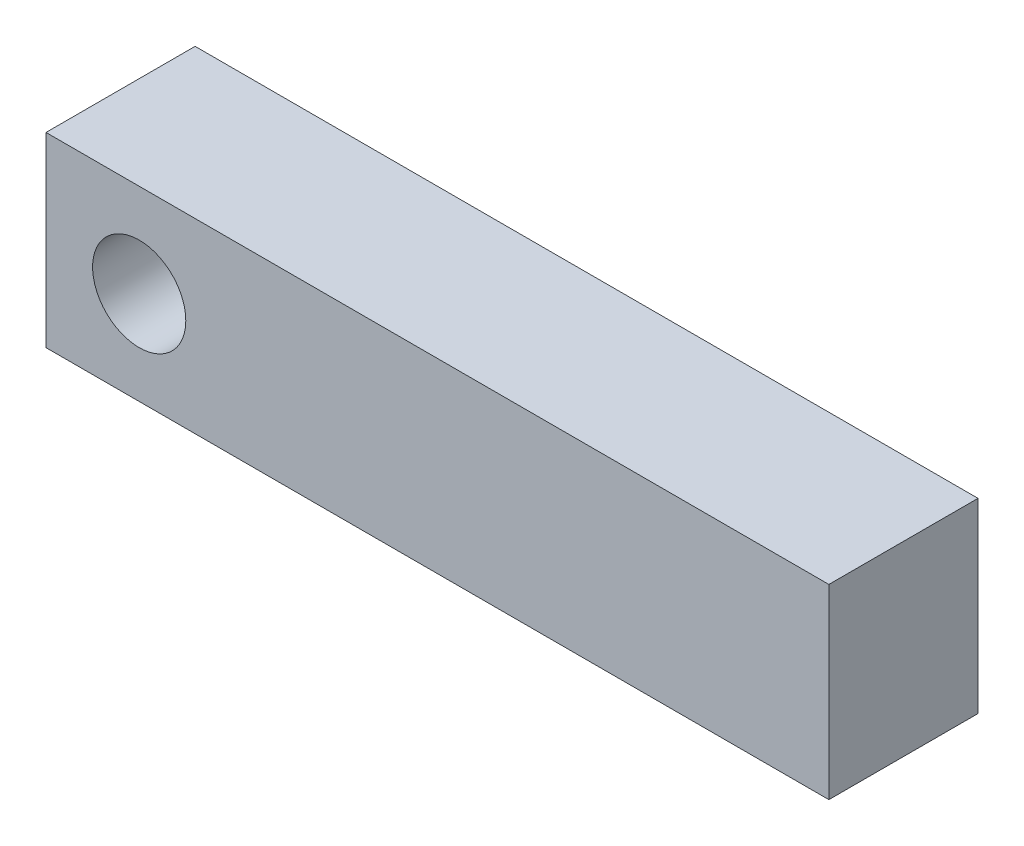
ISO-10303-21;
HEADER;
FILE_DESCRIPTION(('STEP AP214'),'2;1');
FILE_NAME('part.step','',(''),(''),'','','');
FILE_SCHEMA(('AUTOMOTIVE_DESIGN { 1 0 10303 214 1 1 1 1 }'));
ENDSEC;
DATA;
#1=APPLICATION_CONTEXT('core data for automotive mechanical design processes');
#2=APPLICATION_PROTOCOL_DEFINITION('international standard','automotive_design',2000,#1);
#3=PRODUCT_CONTEXT('',#1,'mechanical');
#4=PRODUCT('Part','Part','',(#3));
#5=PRODUCT_RELATED_PRODUCT_CATEGORY('part','',(#4));
#6=PRODUCT_DEFINITION_FORMATION('','',#4);
#7=PRODUCT_DEFINITION_CONTEXT('part definition',#1,'design');
#8=PRODUCT_DEFINITION('design','',#6,#7);
#9=PRODUCT_DEFINITION_SHAPE('','',#8);
#10=(LENGTH_UNIT() NAMED_UNIT(*) SI_UNIT(.MILLI.,.METRE.));
#11=(NAMED_UNIT(*) PLANE_ANGLE_UNIT() SI_UNIT($,.RADIAN.));
#12=(NAMED_UNIT(*) SI_UNIT($,.STERADIAN.) SOLID_ANGLE_UNIT());
#13=UNCERTAINTY_MEASURE_WITH_UNIT(LENGTH_MEASURE(1.E-05),#10,'distance_accuracy_value','');
#14=(GEOMETRIC_REPRESENTATION_CONTEXT(3) GLOBAL_UNCERTAINTY_ASSIGNED_CONTEXT((#13)) GLOBAL_UNIT_ASSIGNED_CONTEXT((#10,
#11,#12)) REPRESENTATION_CONTEXT('',''));
#15=CARTESIAN_POINT('',(0.,0.,0.));
#16=DIRECTION('',(0.,0.,1.));
#17=DIRECTION('',(1.,0.,0.));
#18=AXIS2_PLACEMENT_3D('',#15,#16,#17);
#19=CARTESIAN_POINT('',(0.,0.,40.));
#20=DIRECTION('',(0.,0.,-1.));
#21=DIRECTION('',(-1.,0.,0.));
#22=AXIS2_PLACEMENT_3D('',#19,#20,#21);
#23=PLANE('',#22);
#24=DIRECTION('',(1.,0.,0.));
#25=VECTOR('',#24,1.);
#26=CARTESIAN_POINT('',(-25.,-25.,40.));
#27=LINE('',#26,#25);
#28=CARTESIAN_POINT('',(-25.,-25.,40.));
#29=VERTEX_POINT('',#28);
#30=CARTESIAN_POINT('',(185.,-25.,40.));
#31=VERTEX_POINT('',#30);
#32=EDGE_CURVE('E85',#29,#31,#27,.T.);
#33=ORIENTED_EDGE('',*,*,#32,.T.);
#34=DIRECTION('',(0.,1.,0.));
#35=VECTOR('',#34,1.);
#36=CARTESIAN_POINT('',(185.,25.,40.));
#37=LINE('',#36,#35);
#38=CARTESIAN_POINT('',(185.,25.,40.));
#39=VERTEX_POINT('',#38);
#40=EDGE_CURVE('E80',#31,#39,#37,.T.);
#41=ORIENTED_EDGE('',*,*,#40,.T.);
#42=DIRECTION('',(-1.,0.,0.));
#43=VECTOR('',#42,1.);
#44=CARTESIAN_POINT('',(-25.,25.,40.));
#45=LINE('',#44,#43);
#46=CARTESIAN_POINT('',(-25.,25.,40.));
#47=VERTEX_POINT('',#46);
#48=EDGE_CURVE('E83',#39,#47,#45,.T.);
#49=ORIENTED_EDGE('',*,*,#48,.T.);
#50=DIRECTION('',(0.,-1.,0.));
#51=VECTOR('',#50,1.);
#52=CARTESIAN_POINT('',(-25.,-25.,40.));
#53=LINE('',#52,#51);
#54=EDGE_CURVE('E50',#47,#29,#53,.T.);
#55=ORIENTED_EDGE('',*,*,#54,.T.);
#56=EDGE_LOOP('',(#33,#41,#49,#55));
#57=FACE_BOUND('',#56,.T.);
#58=CARTESIAN_POINT('',(0.,0.,40.));
#59=DIRECTION('',(0.,0.,1.));
#60=DIRECTION('',(1.,0.,0.));
#61=AXIS2_PLACEMENT_3D('',#58,#59,#60);
#62=CIRCLE('',#61,12.5);
#63=CARTESIAN_POINT('',(12.5,0.,40.));
#64=VERTEX_POINT('',#63);
#65=EDGE_CURVE('E100',#64,#64,#62,.T.);
#66=ORIENTED_EDGE('',*,*,#65,.F.);
#67=EDGE_LOOP('',(#66));
#68=FACE_BOUND('',#67,.T.);
#69=ADVANCED_FACE('F33',(#57,#68),#23,.F.);
#70=CARTESIAN_POINT('',(0.,0.,0.));
#71=DIRECTION('',(0.,0.,-1.));
#72=DIRECTION('',(-1.,0.,0.));
#73=AXIS2_PLACEMENT_3D('',#70,#71,#72);
#74=PLANE('',#73);
#75=DIRECTION('',(1.,0.,0.));
#76=VECTOR('',#75,1.);
#77=CARTESIAN_POINT('',(-25.,-25.,0.));
#78=LINE('',#77,#76);
#79=CARTESIAN_POINT('',(-25.,-25.,0.));
#80=VERTEX_POINT('',#79);
#81=CARTESIAN_POINT('',(185.,-25.,0.));
#82=VERTEX_POINT('',#81);
#83=EDGE_CURVE('E97',#80,#82,#78,.T.);
#84=ORIENTED_EDGE('',*,*,#83,.F.);
#85=DIRECTION('',(0.,-1.,0.));
#86=VECTOR('',#85,1.);
#87=CARTESIAN_POINT('',(-25.,-25.,0.));
#88=LINE('',#87,#86);
#89=CARTESIAN_POINT('',(-25.,25.,0.));
#90=VERTEX_POINT('',#89);
#91=EDGE_CURVE('E73',#90,#80,#88,.T.);
#92=ORIENTED_EDGE('',*,*,#91,.F.);
#93=DIRECTION('',(-1.,0.,0.));
#94=VECTOR('',#93,1.);
#95=CARTESIAN_POINT('',(-25.,25.,0.));
#96=LINE('',#95,#94);
#97=CARTESIAN_POINT('',(185.,25.,0.));
#98=VERTEX_POINT('',#97);
#99=EDGE_CURVE('E67',#98,#90,#96,.T.);
#100=ORIENTED_EDGE('',*,*,#99,.F.);
#101=DIRECTION('',(0.,1.,0.));
#102=VECTOR('',#101,1.);
#103=CARTESIAN_POINT('',(185.,25.,0.));
#104=LINE('',#103,#102);
#105=EDGE_CURVE('E89',#82,#98,#104,.T.);
#106=ORIENTED_EDGE('',*,*,#105,.F.);
#107=EDGE_LOOP('',(#84,#92,#100,#106));
#108=FACE_BOUND('',#107,.T.);
#109=CARTESIAN_POINT('',(0.,0.,0.));
#110=DIRECTION('',(0.,0.,1.));
#111=DIRECTION('',(1.,0.,0.));
#112=AXIS2_PLACEMENT_3D('',#109,#110,#111);
#113=CIRCLE('',#112,12.5);
#114=CARTESIAN_POINT('',(12.5,0.,0.));
#115=VERTEX_POINT('',#114);
#116=EDGE_CURVE('E112',#115,#115,#113,.T.);
#117=ORIENTED_EDGE('',*,*,#116,.T.);
#118=EDGE_LOOP('',(#117));
#119=FACE_BOUND('',#118,.T.);
#120=ADVANCED_FACE('F108',(#108,#119),#74,.T.);
#121=CARTESIAN_POINT('',(-25.,-25.,40.));
#122=DIRECTION('',(0.,1.,0.));
#123=DIRECTION('',(-1.,0.,0.));
#124=AXIS2_PLACEMENT_3D('',#121,#122,#123);
#125=PLANE('',#124);
#126=ORIENTED_EDGE('',*,*,#83,.T.);
#127=DIRECTION('',(0.,0.,-1.));
#128=VECTOR('',#127,1.);
#129=CARTESIAN_POINT('',(185.,-25.,40.));
#130=LINE('',#129,#128);
#131=EDGE_CURVE('E11',#31,#82,#130,.T.);
#132=ORIENTED_EDGE('',*,*,#131,.F.);
#133=ORIENTED_EDGE('',*,*,#32,.F.);
#134=DIRECTION('',(0.,0.,-1.));
#135=VECTOR('',#134,1.);
#136=CARTESIAN_POINT('',(-25.,-25.,40.));
#137=LINE('',#136,#135);
#138=EDGE_CURVE('E93',#29,#80,#137,.T.);
#139=ORIENTED_EDGE('',*,*,#138,.T.);
#140=EDGE_LOOP('',(#126,#132,#133,#139));
#141=FACE_BOUND('',#140,.T.);
#142=ADVANCED_FACE('F35',(#141),#125,.F.);
#143=CARTESIAN_POINT('',(185.,25.,40.));
#144=DIRECTION('',(-1.,0.,0.));
#145=DIRECTION('',(0.,0.,1.));
#146=AXIS2_PLACEMENT_3D('',#143,#144,#145);
#147=PLANE('',#146);
#148=ORIENTED_EDGE('',*,*,#105,.T.);
#149=DIRECTION('',(0.,0.,-1.));
#150=VECTOR('',#149,1.);
#151=CARTESIAN_POINT('',(185.,25.,40.));
#152=LINE('',#151,#150);
#153=EDGE_CURVE('E42',#39,#98,#152,.T.);
#154=ORIENTED_EDGE('',*,*,#153,.F.);
#155=ORIENTED_EDGE('',*,*,#40,.F.);
#156=ORIENTED_EDGE('',*,*,#131,.T.);
#157=EDGE_LOOP('',(#148,#154,#155,#156));
#158=FACE_BOUND('',#157,.T.);
#159=ADVANCED_FACE('F88',(#158),#147,.F.);
#160=CARTESIAN_POINT('',(-25.,25.,40.));
#161=DIRECTION('',(0.,-1.,0.));
#162=DIRECTION('',(0.,0.,-1.));
#163=AXIS2_PLACEMENT_3D('',#160,#161,#162);
#164=PLANE('',#163);
#165=ORIENTED_EDGE('',*,*,#99,.T.);
#166=DIRECTION('',(0.,0.,-1.));
#167=VECTOR('',#166,1.);
#168=CARTESIAN_POINT('',(-25.,25.,40.));
#169=LINE('',#168,#167);
#170=EDGE_CURVE('E90',#47,#90,#169,.T.);
#171=ORIENTED_EDGE('',*,*,#170,.F.);
#172=ORIENTED_EDGE('',*,*,#48,.F.);
#173=ORIENTED_EDGE('',*,*,#153,.T.);
#174=EDGE_LOOP('',(#165,#171,#172,#173));
#175=FACE_BOUND('',#174,.T.);
#176=ADVANCED_FACE('F91',(#175),#164,.F.);
#177=CARTESIAN_POINT('',(-25.,-25.,40.));
#178=DIRECTION('',(1.,0.,0.));
#179=DIRECTION('',(0.,1.,0.));
#180=AXIS2_PLACEMENT_3D('',#177,#178,#179);
#181=PLANE('',#180);
#182=ORIENTED_EDGE('',*,*,#91,.T.);
#183=ORIENTED_EDGE('',*,*,#138,.F.);
#184=ORIENTED_EDGE('',*,*,#54,.F.);
#185=ORIENTED_EDGE('',*,*,#170,.T.);
#186=EDGE_LOOP('',(#182,#183,#184,#185));
#187=FACE_BOUND('',#186,.T.);
#188=ADVANCED_FACE('F105',(#187),#181,.F.);
#189=CARTESIAN_POINT('',(0.,0.,40.));
#190=DIRECTION('',(0.,0.,-1.));
#191=DIRECTION('',(-1.,0.,0.));
#192=AXIS2_PLACEMENT_3D('',#189,#190,#191);
#193=CYLINDRICAL_SURFACE('',#192,12.5);
#194=ORIENTED_EDGE('',*,*,#65,.T.);
#195=EDGE_LOOP('',(#194));
#196=FACE_BOUND('',#195,.T.);
#197=ORIENTED_EDGE('',*,*,#116,.F.);
#198=EDGE_LOOP('',(#197));
#199=FACE_BOUND('',#198,.T.);
#200=ADVANCED_FACE('F118',(#196,#199),#193,.F.);
#201=CLOSED_SHELL('',(#69,#120,#142,#159,#176,#188,#200));
#202=MANIFOLD_SOLID_BREP('B2',#201);
#203=ADVANCED_BREP_SHAPE_REPRESENTATION('',(#18,#202),#14);
#204=SHAPE_DEFINITION_REPRESENTATION(#9,#203);
ENDSEC;
END-ISO-10303-21;
